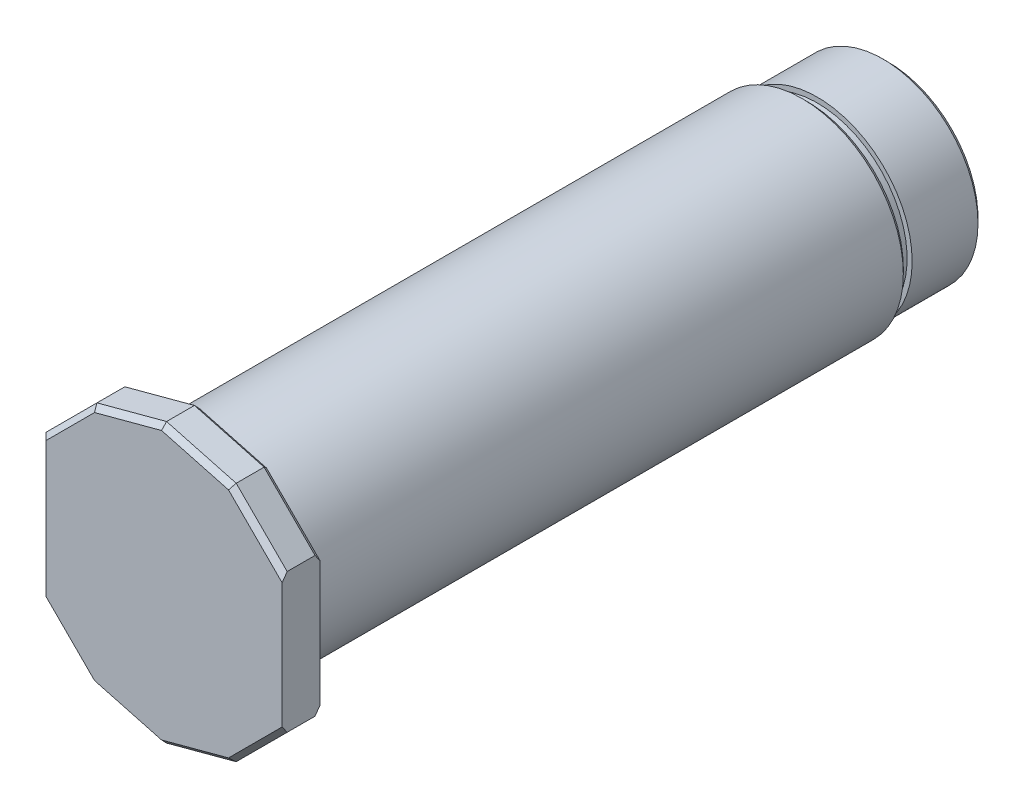
ISO-10303-21;
HEADER;
FILE_DESCRIPTION(('STEP AP214'),'2;1');
FILE_NAME('part.step','',(''),(''),'','','');
FILE_SCHEMA(('AUTOMOTIVE_DESIGN { 1 0 10303 214 1 1 1 1 }'));
ENDSEC;
DATA;
#1=APPLICATION_CONTEXT('core data for automotive mechanical design processes');
#2=APPLICATION_PROTOCOL_DEFINITION('international standard','automotive_design',2000,#1);
#3=PRODUCT_CONTEXT('',#1,'mechanical');
#4=PRODUCT('Part','Part','',(#3));
#5=PRODUCT_RELATED_PRODUCT_CATEGORY('part','',(#4));
#6=PRODUCT_DEFINITION_FORMATION('','',#4);
#7=PRODUCT_DEFINITION_CONTEXT('part definition',#1,'design');
#8=PRODUCT_DEFINITION('design','',#6,#7);
#9=PRODUCT_DEFINITION_SHAPE('','',#8);
#10=(LENGTH_UNIT() NAMED_UNIT(*) SI_UNIT(.MILLI.,.METRE.));
#11=(NAMED_UNIT(*) PLANE_ANGLE_UNIT() SI_UNIT($,.RADIAN.));
#12=(NAMED_UNIT(*) SI_UNIT($,.STERADIAN.) SOLID_ANGLE_UNIT());
#13=UNCERTAINTY_MEASURE_WITH_UNIT(LENGTH_MEASURE(1.E-05),#10,'distance_accuracy_value','');
#14=(GEOMETRIC_REPRESENTATION_CONTEXT(3) GLOBAL_UNCERTAINTY_ASSIGNED_CONTEXT((#13)) GLOBAL_UNIT_ASSIGNED_CONTEXT((#10,
#11,#12)) REPRESENTATION_CONTEXT('',''));
#15=CARTESIAN_POINT('',(0.,0.,0.));
#16=DIRECTION('',(0.,0.,1.));
#17=DIRECTION('',(1.,0.,0.));
#18=AXIS2_PLACEMENT_3D('',#15,#16,#17);
#19=CARTESIAN_POINT('',(0.,0.,-240.));
#20=DIRECTION('',(0.,0.,-1.));
#21=DIRECTION('',(-1.,0.,0.));
#22=AXIS2_PLACEMENT_3D('',#19,#20,#21);
#23=PLANE('',#22);
#24=CARTESIAN_POINT('',(0.,0.,-240.));
#25=DIRECTION('',(0.,0.,-1.));
#26=DIRECTION('',(-1.,0.,0.));
#27=AXIS2_PLACEMENT_3D('',#24,#25,#26);
#28=CIRCLE('',#27,38.0000000000001);
#29=CARTESIAN_POINT('',(-38.0000000000001,0.,-240.));
#30=VERTEX_POINT('',#29);
#31=EDGE_CURVE('E280',#30,#30,#28,.T.);
#32=ORIENTED_EDGE('',*,*,#31,.T.);
#33=EDGE_LOOP('',(#32));
#34=FACE_BOUND('',#33,.T.);
#35=CARTESIAN_POINT('',(0.,0.,-240.));
#36=DIRECTION('',(0.,0.,-1.));
#37=DIRECTION('',(-1.,0.,0.));
#38=AXIS2_PLACEMENT_3D('',#35,#36,#37);
#39=CIRCLE('',#38,35.5);
#40=CARTESIAN_POINT('',(-35.5,0.,-240.));
#41=VERTEX_POINT('',#40);
#42=EDGE_CURVE('E355',#41,#41,#39,.T.);
#43=ORIENTED_EDGE('',*,*,#42,.F.);
#44=EDGE_LOOP('',(#43));
#45=FACE_BOUND('',#44,.T.);
#46=ADVANCED_FACE('F36',(#34,#45),#23,.T.);
#47=CARTESIAN_POINT('',(0.,0.,0.));
#48=DIRECTION('',(0.,0.,1.));
#49=DIRECTION('',(1.,0.,0.));
#50=AXIS2_PLACEMENT_3D('',#47,#48,#49);
#51=PLANE('',#50);
#52=DIRECTION('',(0.,-1.,0.));
#53=VECTOR('',#52,1.);
#54=CARTESIAN_POINT('',(47.6313972081441,27.5,0.));
#55=LINE('',#54,#53);
#56=CARTESIAN_POINT('',(47.6313972081441,24.6715728752538,0.));
#57=VERTEX_POINT('',#56);
#58=CARTESIAN_POINT('',(47.6313972081441,-24.6715728752538,0.));
#59=VERTEX_POINT('',#58);
#60=EDGE_CURVE('E194',#57,#59,#55,.T.);
#61=ORIENTED_EDGE('',*,*,#60,.T.);
#62=DIRECTION('',(-0.707106781186548,-0.707106781186547,0.));
#63=VECTOR('',#62,1.);
#64=CARTESIAN_POINT('',(36.151485041699,-36.151485041699,0.));
#65=LINE('',#64,#63);
#66=CARTESIAN_POINT('',(26.46472381959,-45.838246263808,0.));
#67=VERTEX_POINT('',#66);
#68=EDGE_CURVE('E53',#59,#67,#65,.T.);
#69=ORIENTED_EDGE('',*,*,#68,.T.);
#70=DIRECTION('',(-0.965925826289068,-0.258819045102521,0.));
#71=VECTOR('',#70,1.);
#72=CARTESIAN_POINT('',(13.232361909795,-49.3838469514939,0.));
#73=LINE('',#72,#71);
#74=CARTESIAN_POINT('',(0.,-52.9294476391798,0.));
#75=VERTEX_POINT('',#74);
#76=EDGE_CURVE('E57',#67,#75,#73,.T.);
#77=ORIENTED_EDGE('',*,*,#76,.T.);
#78=DIRECTION('',(-0.965925826289068,0.25881904510252,0.));
#79=VECTOR('',#78,1.);
#80=CARTESIAN_POINT('',(-13.2323619097949,-49.3838469514939,0.));
#81=LINE('',#80,#79);
#82=CARTESIAN_POINT('',(-26.4647238195899,-45.838246263808,0.));
#83=VERTEX_POINT('',#82);
#84=EDGE_CURVE('E276',#75,#83,#81,.T.);
#85=ORIENTED_EDGE('',*,*,#84,.T.);
#86=DIRECTION('',(-0.707106781186547,0.707106781186548,0.));
#87=VECTOR('',#86,1.);
#88=CARTESIAN_POINT('',(-36.151485041699,-36.1514850416989,0.));
#89=LINE('',#88,#87);
#90=CARTESIAN_POINT('',(-45.6313972081441,-26.6715728752538,0.));
#91=VERTEX_POINT('',#90);
#92=EDGE_CURVE('E274',#83,#91,#89,.T.);
#93=ORIENTED_EDGE('',*,*,#92,.T.);
#94=DIRECTION('',(0.,1.,0.));
#95=VECTOR('',#94,1.);
#96=CARTESIAN_POINT('',(-45.6313972081441,0.,0.));
#97=LINE('',#96,#95);
#98=CARTESIAN_POINT('',(-45.6313972081441,26.6715728752538,0.));
#99=VERTEX_POINT('',#98);
#100=EDGE_CURVE('E272',#91,#99,#97,.T.);
#101=ORIENTED_EDGE('',*,*,#100,.T.);
#102=DIRECTION('',(0.707106781186547,0.707106781186548,0.));
#103=VECTOR('',#102,1.);
#104=CARTESIAN_POINT('',(-36.151485041699,36.151485041699,0.));
#105=LINE('',#104,#103);
#106=CARTESIAN_POINT('',(-26.4647238195899,45.838246263808,0.));
#107=VERTEX_POINT('',#106);
#108=EDGE_CURVE('E270',#99,#107,#105,.T.);
#109=ORIENTED_EDGE('',*,*,#108,.T.);
#110=DIRECTION('',(0.965925826289068,0.258819045102521,0.));
#111=VECTOR('',#110,1.);
#112=CARTESIAN_POINT('',(-13.2323619097949,49.3838469514939,0.));
#113=LINE('',#112,#111);
#114=CARTESIAN_POINT('',(0.,52.9294476391798,0.));
#115=VERTEX_POINT('',#114);
#116=EDGE_CURVE('E268',#107,#115,#113,.T.);
#117=ORIENTED_EDGE('',*,*,#116,.T.);
#118=DIRECTION('',(0.965925826289068,-0.25881904510252,0.));
#119=VECTOR('',#118,1.);
#120=CARTESIAN_POINT('',(13.2323619097949,49.383846951494,0.));
#121=LINE('',#120,#119);
#122=CARTESIAN_POINT('',(26.4647238195899,45.838246263808,0.));
#123=VERTEX_POINT('',#122);
#124=EDGE_CURVE('E266',#115,#123,#121,.T.);
#125=ORIENTED_EDGE('',*,*,#124,.T.);
#126=DIRECTION('',(0.707106781186548,-0.707106781186548,0.));
#127=VECTOR('',#126,1.);
#128=CARTESIAN_POINT('',(36.151485041699,36.151485041699,0.));
#129=LINE('',#128,#127);
#130=EDGE_CURVE('E264',#123,#57,#129,.T.);
#131=ORIENTED_EDGE('',*,*,#130,.T.);
#132=EDGE_LOOP('',(#61,#69,#77,#85,#93,#101,#109,#117,#125,#131));
#133=FACE_BOUND('',#132,.T.);
#134=CARTESIAN_POINT('',(0.,0.,0.));
#135=DIRECTION('',(0.,0.,1.));
#136=DIRECTION('',(1.,0.,0.));
#137=AXIS2_PLACEMENT_3D('',#134,#135,#136);
#138=CIRCLE('',#137,40.);
#139=CARTESIAN_POINT('',(40.,0.,0.));
#140=VERTEX_POINT('',#139);
#141=EDGE_CURVE('E202',#140,#140,#138,.F.);
#142=ORIENTED_EDGE('',*,*,#141,.F.);
#143=EDGE_LOOP('',(#142));
#144=FACE_BOUND('',#143,.T.);
#145=ADVANCED_FACE('F346',(#133,#144),#51,.F.);
#146=CARTESIAN_POINT('',(0.,55.,15.));
#147=DIRECTION('',(0.25881904510252,-0.965925826289068,0.));
#148=DIRECTION('',(0.965925826289069,0.258819045102521,0.));
#149=AXIS2_PLACEMENT_3D('',#146,#147,#148);
#150=PLANE('',#149);
#151=DIRECTION('',(0.,0.,-1.));
#152=VECTOR('',#151,1.);
#153=CARTESIAN_POINT('',(-27.5,47.6313972081441,15.));
#154=LINE('',#153,#152);
#155=CARTESIAN_POINT('',(-27.5,47.6313972081441,13.));
#156=VERTEX_POINT('',#155);
#157=CARTESIAN_POINT('',(-27.5,47.6313972081441,1.99999999999997));
#158=VERTEX_POINT('',#157);
#159=EDGE_CURVE('E207',#156,#158,#154,.T.);
#160=ORIENTED_EDGE('',*,*,#159,.F.);
#161=DIRECTION('',(0.965925826289069,0.258819045102521,0.));
#162=VECTOR('',#161,1.);
#163=CARTESIAN_POINT('',(0.,55.,13.));
#164=LINE('',#163,#162);
#165=CARTESIAN_POINT('',(0.,55.,13.));
#166=VERTEX_POINT('',#165);
#167=EDGE_CURVE('E254',#156,#166,#164,.T.);
#168=ORIENTED_EDGE('',*,*,#167,.T.);
#169=DIRECTION('',(0.,0.,-1.));
#170=VECTOR('',#169,1.);
#171=CARTESIAN_POINT('',(0.,55.,15.));
#172=LINE('',#171,#170);
#173=CARTESIAN_POINT('',(0.,55.,1.99999999999997));
#174=VERTEX_POINT('',#173);
#175=EDGE_CURVE('E349',#166,#174,#172,.T.);
#176=ORIENTED_EDGE('',*,*,#175,.T.);
#177=DIRECTION('',(-0.965925826289069,-0.258819045102521,0.));
#178=VECTOR('',#177,1.);
#179=CARTESIAN_POINT('',(0.,55.,1.99999999999997));
#180=LINE('',#179,#178);
#181=EDGE_CURVE('E252',#174,#158,#180,.T.);
#182=ORIENTED_EDGE('',*,*,#181,.T.);
#183=EDGE_LOOP('',(#160,#168,#176,#182));
#184=FACE_BOUND('',#183,.T.);
#185=ADVANCED_FACE('F431',(#184),#150,.F.);
#186=CARTESIAN_POINT('',(-27.5,47.6313972081441,15.));
#187=DIRECTION('',(0.707106781186548,-0.707106781186547,0.));
#188=DIRECTION('',(0.707106781186547,0.707106781186548,0.));
#189=AXIS2_PLACEMENT_3D('',#186,#187,#188);
#190=PLANE('',#189);
#191=DIRECTION('',(0.,0.,-1.));
#192=VECTOR('',#191,1.);
#193=CARTESIAN_POINT('',(-47.6313972081441,27.5,15.));
#194=LINE('',#193,#192);
#195=CARTESIAN_POINT('',(-47.6313972081441,27.5,13.));
#196=VERTEX_POINT('',#195);
#197=CARTESIAN_POINT('',(-47.6313972081441,27.5,1.99999999999997));
#198=VERTEX_POINT('',#197);
#199=EDGE_CURVE('E375',#196,#198,#194,.T.);
#200=ORIENTED_EDGE('',*,*,#199,.F.);
#201=DIRECTION('',(0.707106781186547,0.707106781186548,0.));
#202=VECTOR('',#201,1.);
#203=CARTESIAN_POINT('',(-27.5,47.6313972081441,13.));
#204=LINE('',#203,#202);
#205=EDGE_CURVE('E250',#196,#156,#204,.T.);
#206=ORIENTED_EDGE('',*,*,#205,.T.);
#207=ORIENTED_EDGE('',*,*,#159,.T.);
#208=DIRECTION('',(-0.707106781186547,-0.707106781186548,0.));
#209=VECTOR('',#208,1.);
#210=CARTESIAN_POINT('',(-27.5,47.6313972081441,1.99999999999997));
#211=LINE('',#210,#209);
#212=EDGE_CURVE('E248',#158,#198,#211,.T.);
#213=ORIENTED_EDGE('',*,*,#212,.T.);
#214=EDGE_LOOP('',(#200,#206,#207,#213));
#215=FACE_BOUND('',#214,.T.);
#216=ADVANCED_FACE('F382',(#215),#190,.F.);
#217=CARTESIAN_POINT('',(-47.6313972081441,-27.5,15.));
#218=DIRECTION('',(0.707106781186548,0.707106781186547,0.));
#219=DIRECTION('',(-0.707106781186547,0.707106781186548,0.));
#220=AXIS2_PLACEMENT_3D('',#217,#218,#219);
#221=PLANE('',#220);
#222=DIRECTION('',(0.,0.,-1.));
#223=VECTOR('',#222,1.);
#224=CARTESIAN_POINT('',(-27.5,-47.6313972081441,15.));
#225=LINE('',#224,#223);
#226=CARTESIAN_POINT('',(-27.5,-47.6313972081441,13.));
#227=VERTEX_POINT('',#226);
#228=CARTESIAN_POINT('',(-27.5,-47.6313972081441,1.99999999999997));
#229=VERTEX_POINT('',#228);
#230=EDGE_CURVE('E369',#227,#229,#225,.T.);
#231=ORIENTED_EDGE('',*,*,#230,.F.);
#232=DIRECTION('',(-0.707106781186547,0.707106781186548,0.));
#233=VECTOR('',#232,1.);
#234=CARTESIAN_POINT('',(-47.6313972081441,-27.5,13.));
#235=LINE('',#234,#233);
#236=CARTESIAN_POINT('',(-47.6313972081441,-27.5,13.));
#237=VERTEX_POINT('',#236);
#238=EDGE_CURVE('E242',#227,#237,#235,.T.);
#239=ORIENTED_EDGE('',*,*,#238,.T.);
#240=DIRECTION('',(0.,0.,-1.));
#241=VECTOR('',#240,1.);
#242=CARTESIAN_POINT('',(-47.6313972081441,-27.5,15.));
#243=LINE('',#242,#241);
#244=CARTESIAN_POINT('',(-47.6313972081441,-27.5,1.99999999999997));
#245=VERTEX_POINT('',#244);
#246=EDGE_CURVE('E372',#237,#245,#243,.T.);
#247=ORIENTED_EDGE('',*,*,#246,.T.);
#248=DIRECTION('',(0.707106781186547,-0.707106781186548,0.));
#249=VECTOR('',#248,1.);
#250=CARTESIAN_POINT('',(-47.6313972081441,-27.5,1.99999999999997));
#251=LINE('',#250,#249);
#252=EDGE_CURVE('E240',#245,#229,#251,.T.);
#253=ORIENTED_EDGE('',*,*,#252,.T.);
#254=EDGE_LOOP('',(#231,#239,#247,#253));
#255=FACE_BOUND('',#254,.T.);
#256=ADVANCED_FACE('F404',(#255),#221,.F.);
#257=CARTESIAN_POINT('',(-27.5,-47.6313972081441,15.));
#258=DIRECTION('',(0.25881904510252,0.965925826289068,0.));
#259=DIRECTION('',(-0.965925826289068,0.25881904510252,0.));
#260=AXIS2_PLACEMENT_3D('',#257,#258,#259);
#261=PLANE('',#260);
#262=DIRECTION('',(0.,0.,-1.));
#263=VECTOR('',#262,1.);
#264=CARTESIAN_POINT('',(0.,-55.,15.));
#265=LINE('',#264,#263);
#266=CARTESIAN_POINT('',(0.,-55.,13.));
#267=VERTEX_POINT('',#266);
#268=CARTESIAN_POINT('',(0.,-55.,1.99999999999997));
#269=VERTEX_POINT('',#268);
#270=EDGE_CURVE('E366',#267,#269,#265,.T.);
#271=ORIENTED_EDGE('',*,*,#270,.F.);
#272=DIRECTION('',(-0.965925826289068,0.25881904510252,0.));
#273=VECTOR('',#272,1.);
#274=CARTESIAN_POINT('',(-27.5,-47.6313972081441,13.));
#275=LINE('',#274,#273);
#276=EDGE_CURVE('E238',#267,#227,#275,.T.);
#277=ORIENTED_EDGE('',*,*,#276,.T.);
#278=ORIENTED_EDGE('',*,*,#230,.T.);
#279=DIRECTION('',(0.965925826289068,-0.25881904510252,0.));
#280=VECTOR('',#279,1.);
#281=CARTESIAN_POINT('',(-27.5,-47.6313972081441,1.99999999999997));
#282=LINE('',#281,#280);
#283=EDGE_CURVE('E236',#229,#269,#282,.T.);
#284=ORIENTED_EDGE('',*,*,#283,.T.);
#285=EDGE_LOOP('',(#271,#277,#278,#284));
#286=FACE_BOUND('',#285,.T.);
#287=ADVANCED_FACE('F482',(#286),#261,.F.);
#288=CARTESIAN_POINT('',(0.,-55.,15.));
#289=DIRECTION('',(-0.258819045102521,0.965925826289068,0.));
#290=DIRECTION('',(-0.965925826289068,-0.258819045102521,0.));
#291=AXIS2_PLACEMENT_3D('',#288,#289,#290);
#292=PLANE('',#291);
#293=DIRECTION('',(0.,0.,-1.));
#294=VECTOR('',#293,1.);
#295=CARTESIAN_POINT('',(27.5,-47.6313972081441,15.));
#296=LINE('',#295,#294);
#297=CARTESIAN_POINT('',(27.5,-47.6313972081441,13.));
#298=VERTEX_POINT('',#297);
#299=CARTESIAN_POINT('',(27.5,-47.6313972081441,1.99999999999997));
#300=VERTEX_POINT('',#299);
#301=EDGE_CURVE('E363',#298,#300,#296,.T.);
#302=ORIENTED_EDGE('',*,*,#301,.F.);
#303=DIRECTION('',(-0.965925826289068,-0.258819045102521,0.));
#304=VECTOR('',#303,1.);
#305=CARTESIAN_POINT('',(0.,-55.,13.));
#306=LINE('',#305,#304);
#307=EDGE_CURVE('E234',#298,#267,#306,.T.);
#308=ORIENTED_EDGE('',*,*,#307,.T.);
#309=ORIENTED_EDGE('',*,*,#270,.T.);
#310=DIRECTION('',(0.965925826289068,0.258819045102521,0.));
#311=VECTOR('',#310,1.);
#312=CARTESIAN_POINT('',(0.,-55.,1.99999999999997));
#313=LINE('',#312,#311);
#314=EDGE_CURVE('E232',#269,#300,#313,.T.);
#315=ORIENTED_EDGE('',*,*,#314,.T.);
#316=EDGE_LOOP('',(#302,#308,#309,#315));
#317=FACE_BOUND('',#316,.T.);
#318=ADVANCED_FACE('F478',(#317),#292,.F.);
#319=CARTESIAN_POINT('',(27.5,-47.6313972081441,15.));
#320=DIRECTION('',(-0.707106781186547,0.707106781186548,0.));
#321=DIRECTION('',(-0.707106781186548,-0.707106781186547,0.));
#322=AXIS2_PLACEMENT_3D('',#319,#320,#321);
#323=PLANE('',#322);
#324=DIRECTION('',(0.,0.,-1.));
#325=VECTOR('',#324,1.);
#326=CARTESIAN_POINT('',(47.6313972081441,-27.5,15.));
#327=LINE('',#326,#325);
#328=CARTESIAN_POINT('',(47.6313972081441,-27.5,13.));
#329=VERTEX_POINT('',#328);
#330=CARTESIAN_POINT('',(47.6313972081441,-27.5,1.99999999999997));
#331=VERTEX_POINT('',#330);
#332=EDGE_CURVE('E361',#329,#331,#327,.T.);
#333=ORIENTED_EDGE('',*,*,#332,.F.);
#334=DIRECTION('',(-0.707106781186548,-0.707106781186547,0.));
#335=VECTOR('',#334,1.);
#336=CARTESIAN_POINT('',(27.5,-47.6313972081441,13.));
#337=LINE('',#336,#335);
#338=EDGE_CURVE('E230',#329,#298,#337,.T.);
#339=ORIENTED_EDGE('',*,*,#338,.T.);
#340=ORIENTED_EDGE('',*,*,#301,.T.);
#341=DIRECTION('',(0.707106781186548,0.707106781186547,0.));
#342=VECTOR('',#341,1.);
#343=CARTESIAN_POINT('',(27.5,-47.6313972081441,1.99999999999997));
#344=LINE('',#343,#342);
#345=EDGE_CURVE('E227',#300,#331,#344,.T.);
#346=ORIENTED_EDGE('',*,*,#345,.T.);
#347=EDGE_LOOP('',(#333,#339,#340,#346));
#348=FACE_BOUND('',#347,.T.);
#349=ADVANCED_FACE('F474',(#348),#323,.F.);
#350=CARTESIAN_POINT('',(47.6313972081441,27.5,15.));
#351=DIRECTION('',(-0.707106781186547,-0.707106781186547,0.));
#352=DIRECTION('',(0.707106781186548,-0.707106781186548,0.));
#353=AXIS2_PLACEMENT_3D('',#350,#351,#352);
#354=PLANE('',#353);
#355=DIRECTION('',(0.,0.,-1.));
#356=VECTOR('',#355,1.);
#357=CARTESIAN_POINT('',(27.5,47.6313972081441,15.));
#358=LINE('',#357,#356);
#359=CARTESIAN_POINT('',(27.5,47.6313972081441,13.));
#360=VERTEX_POINT('',#359);
#361=CARTESIAN_POINT('',(27.5,47.6313972081441,1.99999999999997));
#362=VERTEX_POINT('',#361);
#363=EDGE_CURVE('E352',#360,#362,#358,.T.);
#364=ORIENTED_EDGE('',*,*,#363,.F.);
#365=DIRECTION('',(0.707106781186548,-0.707106781186548,0.));
#366=VECTOR('',#365,1.);
#367=CARTESIAN_POINT('',(47.6313972081441,27.5,13.));
#368=LINE('',#367,#366);
#369=CARTESIAN_POINT('',(47.6313972081441,27.5,13.));
#370=VERTEX_POINT('',#369);
#371=EDGE_CURVE('E262',#360,#370,#368,.T.);
#372=ORIENTED_EDGE('',*,*,#371,.T.);
#373=DIRECTION('',(0.,0.,-1.));
#374=VECTOR('',#373,1.);
#375=CARTESIAN_POINT('',(47.6313972081441,27.5,15.));
#376=LINE('',#375,#374);
#377=CARTESIAN_POINT('',(47.6313972081441,27.5,1.99999999999997));
#378=VERTEX_POINT('',#377);
#379=EDGE_CURVE('E180',#370,#378,#376,.T.);
#380=ORIENTED_EDGE('',*,*,#379,.T.);
#381=DIRECTION('',(-0.707106781186548,0.707106781186548,0.));
#382=VECTOR('',#381,1.);
#383=CARTESIAN_POINT('',(47.6313972081441,27.5,1.99999999999997));
#384=LINE('',#383,#382);
#385=EDGE_CURVE('E260',#378,#362,#384,.T.);
#386=ORIENTED_EDGE('',*,*,#385,.T.);
#387=EDGE_LOOP('',(#364,#372,#380,#386));
#388=FACE_BOUND('',#387,.T.);
#389=ADVANCED_FACE('F471',(#388),#354,.F.);
#390=CARTESIAN_POINT('',(27.5,47.6313972081441,15.));
#391=DIRECTION('',(-0.25881904510252,-0.965925826289068,0.));
#392=DIRECTION('',(0.965925826289068,-0.25881904510252,0.));
#393=AXIS2_PLACEMENT_3D('',#390,#391,#392);
#394=PLANE('',#393);
#395=ORIENTED_EDGE('',*,*,#175,.F.);
#396=DIRECTION('',(0.965925826289068,-0.25881904510252,0.));
#397=VECTOR('',#396,1.);
#398=CARTESIAN_POINT('',(27.5,47.6313972081441,13.));
#399=LINE('',#398,#397);
#400=EDGE_CURVE('E258',#166,#360,#399,.T.);
#401=ORIENTED_EDGE('',*,*,#400,.T.);
#402=ORIENTED_EDGE('',*,*,#363,.T.);
#403=DIRECTION('',(-0.965925826289068,0.25881904510252,0.));
#404=VECTOR('',#403,1.);
#405=CARTESIAN_POINT('',(27.5,47.6313972081441,1.99999999999997));
#406=LINE('',#405,#404);
#407=EDGE_CURVE('E256',#362,#174,#406,.T.);
#408=ORIENTED_EDGE('',*,*,#407,.T.);
#409=EDGE_LOOP('',(#395,#401,#402,#408));
#410=FACE_BOUND('',#409,.T.);
#411=ADVANCED_FACE('F434',(#410),#394,.F.);
#412=CARTESIAN_POINT('',(0.,0.,15.));
#413=DIRECTION('',(0.,0.,1.));
#414=DIRECTION('',(1.,0.,0.));
#415=AXIS2_PLACEMENT_3D('',#412,#413,#414);
#416=PLANE('',#415);
#417=DIRECTION('',(0.965925826289068,0.258819045102521,0.));
#418=VECTOR('',#417,1.);
#419=CARTESIAN_POINT('',(26.982361909795,-45.699545555566,15.));
#420=LINE('',#419,#418);
#421=CARTESIAN_POINT('',(0.,-52.9294476391798,15.));
#422=VERTEX_POINT('',#421);
#423=CARTESIAN_POINT('',(26.46472381959,-45.838246263808,15.));
#424=VERTEX_POINT('',#423);
#425=EDGE_CURVE('E220',#422,#424,#420,.T.);
#426=ORIENTED_EDGE('',*,*,#425,.T.);
#427=DIRECTION('',(0.707106781186548,0.707106781186547,0.));
#428=VECTOR('',#427,1.);
#429=CARTESIAN_POINT('',(46.2171836457711,-26.0857864376269,15.));
#430=LINE('',#429,#428);
#431=CARTESIAN_POINT('',(47.6313972081441,-24.6715728752539,15.));
#432=VERTEX_POINT('',#431);
#433=EDGE_CURVE('E193',#424,#432,#430,.T.);
#434=ORIENTED_EDGE('',*,*,#433,.T.);
#435=DIRECTION('',(0.,-1.,0.));
#436=VECTOR('',#435,1.);
#437=CARTESIAN_POINT('',(47.6313972081441,27.5,15.));
#438=LINE('',#437,#436);
#439=CARTESIAN_POINT('',(47.6313972081441,24.6715728752539,15.));
#440=VERTEX_POINT('',#439);
#441=EDGE_CURVE('E178',#440,#432,#438,.T.);
#442=ORIENTED_EDGE('',*,*,#441,.F.);
#443=DIRECTION('',(-0.707106781186548,0.707106781186548,0.));
#444=VECTOR('',#443,1.);
#445=CARTESIAN_POINT('',(26.0857864376269,46.2171836457711,15.));
#446=LINE('',#445,#444);
#447=CARTESIAN_POINT('',(26.46472381959,45.8382462638081,15.));
#448=VERTEX_POINT('',#447);
#449=EDGE_CURVE('E190',#440,#448,#446,.T.);
#450=ORIENTED_EDGE('',*,*,#449,.T.);
#451=DIRECTION('',(-0.965925826289068,0.25881904510252,0.));
#452=VECTOR('',#451,1.);
#453=CARTESIAN_POINT('',(-0.517638090205031,53.0681483474219,15.));
#454=LINE('',#453,#452);
#455=CARTESIAN_POINT('',(0.,52.9294476391799,15.));
#456=VERTEX_POINT('',#455);
#457=EDGE_CURVE('E201',#448,#456,#454,.T.);
#458=ORIENTED_EDGE('',*,*,#457,.T.);
#459=DIRECTION('',(-0.965925826289068,-0.258819045102521,0.));
#460=VECTOR('',#459,1.);
#461=CARTESIAN_POINT('',(-26.982361909795,45.699545555566,15.));
#462=LINE('',#461,#460);
#463=CARTESIAN_POINT('',(-26.46472381959,45.8382462638081,15.));
#464=VERTEX_POINT('',#463);
#465=EDGE_CURVE('E204',#456,#464,#462,.T.);
#466=ORIENTED_EDGE('',*,*,#465,.T.);
#467=DIRECTION('',(-0.707106781186547,-0.707106781186548,0.));
#468=VECTOR('',#467,1.);
#469=CARTESIAN_POINT('',(-46.2171836457711,26.085786437627,15.));
#470=LINE('',#469,#468);
#471=CARTESIAN_POINT('',(-45.6313972081442,26.6715728752538,15.));
#472=VERTEX_POINT('',#471);
#473=EDGE_CURVE('E212',#464,#472,#470,.T.);
#474=ORIENTED_EDGE('',*,*,#473,.T.);
#475=DIRECTION('',(0.,-1.,0.));
#476=VECTOR('',#475,1.);
#477=CARTESIAN_POINT('',(-45.6313972081442,-27.5,15.));
#478=LINE('',#477,#476);
#479=CARTESIAN_POINT('',(-45.6313972081442,-26.6715728752538,15.));
#480=VERTEX_POINT('',#479);
#481=EDGE_CURVE('E214',#472,#480,#478,.T.);
#482=ORIENTED_EDGE('',*,*,#481,.T.);
#483=DIRECTION('',(0.707106781186547,-0.707106781186548,0.));
#484=VECTOR('',#483,1.);
#485=CARTESIAN_POINT('',(-26.0857864376269,-46.217183645771,15.));
#486=LINE('',#485,#484);
#487=CARTESIAN_POINT('',(-26.4647238195899,-45.838246263808,15.));
#488=VERTEX_POINT('',#487);
#489=EDGE_CURVE('E216',#480,#488,#486,.T.);
#490=ORIENTED_EDGE('',*,*,#489,.T.);
#491=DIRECTION('',(0.965925826289068,-0.25881904510252,0.));
#492=VECTOR('',#491,1.);
#493=CARTESIAN_POINT('',(0.517638090205093,-53.0681483474219,15.));
#494=LINE('',#493,#492);
#495=EDGE_CURVE('E218',#488,#422,#494,.T.);
#496=ORIENTED_EDGE('',*,*,#495,.T.);
#497=EDGE_LOOP('',(#426,#434,#442,#450,#458,#466,#474,#482,#490,#496));
#498=FACE_BOUND('',#497,.T.);
#499=ADVANCED_FACE('F189',(#498),#416,.T.);
#500=CARTESIAN_POINT('',(-47.6313972081441,27.5,0.));
#501=DIRECTION('',(1.,0.,0.));
#502=DIRECTION('',(0.,1.,0.));
#503=AXIS2_PLACEMENT_3D('',#500,#501,#502);
#504=PLANE('',#503);
#505=ORIENTED_EDGE('',*,*,#246,.F.);
#506=DIRECTION('',(0.,1.,0.));
#507=VECTOR('',#506,1.);
#508=CARTESIAN_POINT('',(-47.6313972081441,27.5,13.));
#509=LINE('',#508,#507);
#510=EDGE_CURVE('E246',#237,#196,#509,.T.);
#511=ORIENTED_EDGE('',*,*,#510,.T.);
#512=ORIENTED_EDGE('',*,*,#199,.T.);
#513=DIRECTION('',(0.,-1.,0.));
#514=VECTOR('',#513,1.);
#515=CARTESIAN_POINT('',(-47.6313972081441,27.5,1.99999999999997));
#516=LINE('',#515,#514);
#517=EDGE_CURVE('E244',#198,#245,#516,.T.);
#518=ORIENTED_EDGE('',*,*,#517,.T.);
#519=EDGE_LOOP('',(#505,#511,#512,#518));
#520=FACE_BOUND('',#519,.T.);
#521=ADVANCED_FACE('F400',(#520),#504,.F.);
#522=CARTESIAN_POINT('',(47.6313972081441,27.5,0.));
#523=DIRECTION('',(-1.,0.,0.));
#524=DIRECTION('',(0.,-1.,0.));
#525=AXIS2_PLACEMENT_3D('',#522,#523,#524);
#526=PLANE('',#525);
#527=ORIENTED_EDGE('',*,*,#441,.T.);
#528=DIRECTION('',(0.,-0.816496580927723,-0.57735026918963));
#529=VECTOR('',#528,1.);
#530=CARTESIAN_POINT('',(47.6313972081441,-32.3248476528839,9.58831750645377));
#531=LINE('',#530,#529);
#532=EDGE_CURVE('E184',#432,#329,#531,.T.);
#533=ORIENTED_EDGE('',*,*,#532,.T.);
#534=ORIENTED_EDGE('',*,*,#332,.T.);
#535=DIRECTION('',(0.,-0.816496580927728,0.577350269189623));
#536=VECTOR('',#535,1.);
#537=CARTESIAN_POINT('',(47.6313972081441,-40.9209314720961,11.490031653759));
#538=LINE('',#537,#536);
#539=EDGE_CURVE('E185',#331,#59,#538,.F.);
#540=ORIENTED_EDGE('',*,*,#539,.T.);
#541=ORIENTED_EDGE('',*,*,#60,.F.);
#542=DIRECTION('',(0.,-0.816496580927727,-0.577350269189624));
#543=VECTOR('',#542,1.);
#544=CARTESIAN_POINT('',(47.6313972081441,27.5,1.99999999999997));
#545=LINE('',#544,#543);
#546=EDGE_CURVE('E223',#57,#378,#545,.F.);
#547=ORIENTED_EDGE('',*,*,#546,.T.);
#548=ORIENTED_EDGE('',*,*,#379,.F.);
#549=DIRECTION('',(0.,-0.816496580927722,0.577350269189631));
#550=VECTOR('',#549,1.);
#551=CARTESIAN_POINT('',(47.6313972081441,32.3248476528839,9.58831750645378));
#552=LINE('',#551,#550);
#553=EDGE_CURVE('E175',#370,#440,#552,.T.);
#554=ORIENTED_EDGE('',*,*,#553,.T.);
#555=EDGE_LOOP('',(#527,#533,#534,#540,#541,#547,#548,#554));
#556=FACE_BOUND('',#555,.T.);
#557=ADVANCED_FACE('F177',(#556),#526,.F.);
#558=CARTESIAN_POINT('',(0.,0.,-240.));
#559=DIRECTION('',(0.,0.,1.));
#560=DIRECTION('',(1.,0.,0.));
#561=AXIS2_PLACEMENT_3D('',#558,#559,#560);
#562=CYLINDRICAL_SURFACE('',#561,40.);
#563=CARTESIAN_POINT('',(0.,0.,-238.));
#564=DIRECTION('',(0.,0.,-1.));
#565=DIRECTION('',(-1.,0.,0.));
#566=AXIS2_PLACEMENT_3D('',#563,#564,#565);
#567=CIRCLE('',#566,40.);
#568=CARTESIAN_POINT('',(-40.,0.,-238.));
#569=VERTEX_POINT('',#568);
#570=EDGE_CURVE('E283',#569,#569,#567,.F.);
#571=ORIENTED_EDGE('',*,*,#570,.T.);
#572=EDGE_LOOP('',(#571));
#573=FACE_BOUND('',#572,.T.);
#574=ORIENTED_EDGE('',*,*,#141,.T.);
#575=EDGE_LOOP('',(#574));
#576=FACE_BOUND('',#575,.T.);
#577=ADVANCED_FACE('F459',(#573,#576),#562,.T.);
#578=CARTESIAN_POINT('',(0.,0.,-244.));
#579=DIRECTION('',(0.,0.,1.));
#580=DIRECTION('',(1.,0.,0.));
#581=AXIS2_PLACEMENT_3D('',#578,#579,#580);
#582=CYLINDRICAL_SURFACE('',#581,35.5);
#583=CARTESIAN_POINT('',(0.,0.,-244.));
#584=DIRECTION('',(0.,0.,-1.));
#585=DIRECTION('',(-1.,0.,0.));
#586=AXIS2_PLACEMENT_3D('',#583,#584,#585);
#587=CIRCLE('',#586,35.5);
#588=CARTESIAN_POINT('',(-35.5,0.,-244.));
#589=VERTEX_POINT('',#588);
#590=EDGE_CURVE('E195',#589,#589,#587,.T.);
#591=ORIENTED_EDGE('',*,*,#590,.F.);
#592=EDGE_LOOP('',(#591));
#593=FACE_BOUND('',#592,.T.);
#594=ORIENTED_EDGE('',*,*,#42,.T.);
#595=EDGE_LOOP('',(#594));
#596=FACE_BOUND('',#595,.T.);
#597=ADVANCED_FACE('F457',(#593,#596),#582,.T.);
#598=CARTESIAN_POINT('',(0.,0.,-244.));
#599=DIRECTION('',(0.,0.,-1.));
#600=DIRECTION('',(-1.,0.,0.));
#601=AXIS2_PLACEMENT_3D('',#598,#599,#600);
#602=PLANE('',#601);
#603=CARTESIAN_POINT('',(0.,0.,-244.));
#604=DIRECTION('',(0.,0.,-1.));
#605=DIRECTION('',(-1.,0.,0.));
#606=AXIS2_PLACEMENT_3D('',#603,#604,#605);
#607=CIRCLE('',#606,37.5);
#608=CARTESIAN_POINT('',(-37.5,0.,-244.));
#609=VERTEX_POINT('',#608);
#610=EDGE_CURVE('E310',#609,#609,#607,.T.);
#611=ORIENTED_EDGE('',*,*,#610,.F.);
#612=EDGE_LOOP('',(#611));
#613=FACE_BOUND('',#612,.T.);
#614=ORIENTED_EDGE('',*,*,#590,.T.);
#615=EDGE_LOOP('',(#614));
#616=FACE_BOUND('',#615,.T.);
#617=ADVANCED_FACE('F671',(#613,#616),#602,.F.);
#618=CARTESIAN_POINT('',(0.,0.,-272.));
#619=DIRECTION('',(0.,0.,1.));
#620=DIRECTION('',(1.,0.,0.));
#621=AXIS2_PLACEMENT_3D('',#618,#619,#620);
#622=CYLINDRICAL_SURFACE('',#621,37.5);
#623=CARTESIAN_POINT('',(0.,0.,-270.));
#624=DIRECTION('',(0.,0.,-1.));
#625=DIRECTION('',(-1.,0.,0.));
#626=AXIS2_PLACEMENT_3D('',#623,#624,#625);
#627=CIRCLE('',#626,37.5);
#628=CARTESIAN_POINT('',(-37.5,0.,-270.));
#629=VERTEX_POINT('',#628);
#630=EDGE_CURVE('E11',#629,#629,#627,.F.);
#631=ORIENTED_EDGE('',*,*,#630,.T.);
#632=EDGE_LOOP('',(#631));
#633=FACE_BOUND('',#632,.T.);
#634=ORIENTED_EDGE('',*,*,#610,.T.);
#635=EDGE_LOOP('',(#634));
#636=FACE_BOUND('',#635,.T.);
#637=ADVANCED_FACE('F662',(#633,#636),#622,.T.);
#638=CARTESIAN_POINT('',(0.,0.,-272.));
#639=DIRECTION('',(0.,0.,-1.));
#640=DIRECTION('',(-1.,0.,0.));
#641=AXIS2_PLACEMENT_3D('',#638,#639,#640);
#642=PLANE('',#641);
#643=CARTESIAN_POINT('',(0.,0.,-272.));
#644=DIRECTION('',(0.,0.,-1.));
#645=DIRECTION('',(-1.,0.,0.));
#646=AXIS2_PLACEMENT_3D('',#643,#644,#645);
#647=CIRCLE('',#646,35.5);
#648=CARTESIAN_POINT('',(-35.5,0.,-272.));
#649=VERTEX_POINT('',#648);
#650=EDGE_CURVE('E45',#649,#649,#647,.T.);
#651=ORIENTED_EDGE('',*,*,#650,.T.);
#652=EDGE_LOOP('',(#651));
#653=FACE_BOUND('',#652,.T.);
#654=ADVANCED_FACE('F445',(#653),#642,.T.);
#655=CARTESIAN_POINT('',(36.151485041699,36.151485041699,15.));
#656=DIRECTION('',(0.500000000000004,0.500000000000004,0.707106781186543));
#657=DIRECTION('',(0.707106781186548,-0.707106781186548,0.));
#658=AXIS2_PLACEMENT_3D('',#655,#656,#657);
#659=PLANE('',#658);
#660=ORIENTED_EDGE('',*,*,#553,.F.);
#661=ORIENTED_EDGE('',*,*,#371,.F.);
#662=DIRECTION('',(-0.35962729833819,-0.622892752510499,0.694746590606869));
#663=VECTOR('',#662,1.);
#664=CARTESIAN_POINT('',(25.5476060261541,44.2497516490515,16.7717355248581));
#665=LINE('',#664,#663);
#666=EDGE_CURVE('E199',#448,#360,#665,.F.);
#667=ORIENTED_EDGE('',*,*,#666,.F.);
#668=ORIENTED_EDGE('',*,*,#449,.F.);
#669=EDGE_LOOP('',(#660,#661,#667,#668));
#670=FACE_BOUND('',#669,.T.);
#671=ADVANCED_FACE('F197',(#670),#659,.T.);
#672=CARTESIAN_POINT('',(13.2323619097949,49.383846951494,15.));
#673=DIRECTION('',(0.183012701892219,0.683012701892221,0.707106781186546));
#674=DIRECTION('',(0.965925826289068,-0.25881904510252,0.));
#675=AXIS2_PLACEMENT_3D('',#672,#673,#674);
#676=PLANE('',#675);
#677=ORIENTED_EDGE('',*,*,#666,.T.);
#678=ORIENTED_EDGE('',*,*,#400,.F.);
#679=DIRECTION('',(0.,-0.719254596676402,0.694746590606868));
#680=VECTOR('',#679,1.);
#681=CARTESIAN_POINT('',(0.,51.0952120523081,16.771735524858));
#682=LINE('',#681,#680);
#683=EDGE_CURVE('E306',#456,#166,#682,.F.);
#684=ORIENTED_EDGE('',*,*,#683,.F.);
#685=ORIENTED_EDGE('',*,*,#457,.F.);
#686=EDGE_LOOP('',(#677,#678,#684,#685));
#687=FACE_BOUND('',#686,.T.);
#688=ADVANCED_FACE('F437',(#687),#676,.T.);
#689=CARTESIAN_POINT('',(-13.232361909795,49.383846951494,15.));
#690=DIRECTION('',(-0.18301270189222,0.683012701892221,0.707106781186546));
#691=DIRECTION('',(0.965925826289069,0.258819045102521,0.));
#692=AXIS2_PLACEMENT_3D('',#689,#690,#691);
#693=PLANE('',#692);
#694=ORIENTED_EDGE('',*,*,#683,.T.);
#695=ORIENTED_EDGE('',*,*,#167,.F.);
#696=DIRECTION('',(0.359627298338196,-0.622892752510497,0.694746590606868));
#697=VECTOR('',#696,1.);
#698=CARTESIAN_POINT('',(-25.5476060261541,44.2497516490517,16.7717355248579));
#699=LINE('',#698,#697);
#700=EDGE_CURVE('E303',#464,#156,#699,.F.);
#701=ORIENTED_EDGE('',*,*,#700,.F.);
#702=ORIENTED_EDGE('',*,*,#465,.F.);
#703=EDGE_LOOP('',(#694,#695,#701,#702));
#704=FACE_BOUND('',#703,.T.);
#705=ADVANCED_FACE('F428',(#704),#693,.T.);
#706=CARTESIAN_POINT('',(-36.151485041699,36.151485041699,15.));
#707=DIRECTION('',(-0.500000000000002,0.500000000000002,0.707106781186544));
#708=DIRECTION('',(0.707106781186547,0.707106781186548,0.));
#709=AXIS2_PLACEMENT_3D('',#706,#707,#708);
#710=PLANE('',#709);
#711=ORIENTED_EDGE('',*,*,#700,.T.);
#712=ORIENTED_EDGE('',*,*,#205,.F.);
#713=DIRECTION('',(0.678598344545844,-0.281084637714819,0.67859834454585));
#714=VECTOR('',#713,1.);
#715=CARTESIAN_POINT('',(-43.0741705820984,25.6123349246841,17.5572266260458));
#716=LINE('',#715,#714);
#717=EDGE_CURVE('E300',#472,#196,#716,.F.);
#718=ORIENTED_EDGE('',*,*,#717,.F.);
#719=ORIENTED_EDGE('',*,*,#473,.F.);
#720=EDGE_LOOP('',(#711,#712,#718,#719));
#721=FACE_BOUND('',#720,.T.);
#722=ADVANCED_FACE('F424',(#721),#710,.T.);
#723=CARTESIAN_POINT('',(-47.6313972081441,27.5,13.));
#724=DIRECTION('',(-0.707106781186551,0.,0.707106781186544));
#725=DIRECTION('',(0.,-1.,0.));
#726=AXIS2_PLACEMENT_3D('',#723,#724,#725);
#727=PLANE('',#726);
#728=ORIENTED_EDGE('',*,*,#717,.T.);
#729=ORIENTED_EDGE('',*,*,#510,.F.);
#730=DIRECTION('',(0.678598344545844,0.28108463771482,0.67859834454585));
#731=VECTOR('',#730,1.);
#732=CARTESIAN_POINT('',(-37.1405008674641,-23.15452845424,23.4908963406801));
#733=LINE('',#732,#731);
#734=EDGE_CURVE('E297',#480,#237,#733,.F.);
#735=ORIENTED_EDGE('',*,*,#734,.F.);
#736=ORIENTED_EDGE('',*,*,#481,.F.);
#737=EDGE_LOOP('',(#728,#729,#735,#736));
#738=FACE_BOUND('',#737,.T.);
#739=ADVANCED_FACE('F422',(#738),#727,.T.);
#740=CARTESIAN_POINT('',(-36.151485041699,-36.151485041699,15.));
#741=DIRECTION('',(-0.500000000000002,-0.500000000000002,0.707106781186545));
#742=DIRECTION('',(-0.707106781186547,0.707106781186548,0.));
#743=AXIS2_PLACEMENT_3D('',#740,#741,#742);
#744=PLANE('',#743);
#745=ORIENTED_EDGE('',*,*,#734,.T.);
#746=ORIENTED_EDGE('',*,*,#238,.F.);
#747=DIRECTION('',(0.359627298338202,0.622892752510493,0.694746590606869));
#748=VECTOR('',#747,1.);
#749=CARTESIAN_POINT('',(-25.547606026154,-44.2497516490516,16.7717355248579));
#750=LINE('',#749,#748);
#751=EDGE_CURVE('E294',#488,#227,#750,.F.);
#752=ORIENTED_EDGE('',*,*,#751,.F.);
#753=ORIENTED_EDGE('',*,*,#489,.F.);
#754=EDGE_LOOP('',(#745,#746,#752,#753));
#755=FACE_BOUND('',#754,.T.);
#756=ADVANCED_FACE('F408',(#755),#744,.T.);
#757=CARTESIAN_POINT('',(-13.2323619097949,-49.3838469514939,15.));
#758=DIRECTION('',(-0.18301270189222,-0.683012701892223,0.707106781186544));
#759=DIRECTION('',(-0.965925826289068,0.25881904510252,0.));
#760=AXIS2_PLACEMENT_3D('',#757,#758,#759);
#761=PLANE('',#760);
#762=ORIENTED_EDGE('',*,*,#751,.T.);
#763=ORIENTED_EDGE('',*,*,#276,.F.);
#764=DIRECTION('',(0.,0.719254596676401,0.694746590606868));
#765=VECTOR('',#764,1.);
#766=CARTESIAN_POINT('',(0.,-51.095212052308,16.771735524858));
#767=LINE('',#766,#765);
#768=EDGE_CURVE('E291',#422,#267,#767,.F.);
#769=ORIENTED_EDGE('',*,*,#768,.F.);
#770=ORIENTED_EDGE('',*,*,#495,.F.);
#771=EDGE_LOOP('',(#762,#763,#769,#770));
#772=FACE_BOUND('',#771,.T.);
#773=ADVANCED_FACE('F414',(#772),#761,.T.);
#774=CARTESIAN_POINT('',(13.232361909795,-49.383846951494,15.));
#775=DIRECTION('',(0.18301270189222,-0.683012701892221,0.707106781186546));
#776=DIRECTION('',(-0.965925826289068,-0.258819045102521,0.));
#777=AXIS2_PLACEMENT_3D('',#774,#775,#776);
#778=PLANE('',#777);
#779=ORIENTED_EDGE('',*,*,#768,.T.);
#780=ORIENTED_EDGE('',*,*,#307,.F.);
#781=DIRECTION('',(-0.359627298338194,0.622892752510497,0.694746590606869));
#782=VECTOR('',#781,1.);
#783=CARTESIAN_POINT('',(25.5476060261541,-44.2497516490517,16.7717355248579));
#784=LINE('',#783,#782);
#785=EDGE_CURVE('E288',#424,#298,#784,.F.);
#786=ORIENTED_EDGE('',*,*,#785,.F.);
#787=ORIENTED_EDGE('',*,*,#425,.F.);
#788=EDGE_LOOP('',(#779,#780,#786,#787));
#789=FACE_BOUND('',#788,.T.);
#790=ADVANCED_FACE('F496',(#789),#778,.T.);
#791=CARTESIAN_POINT('',(36.151485041699,-36.151485041699,15.));
#792=DIRECTION('',(0.500000000000003,-0.500000000000003,0.707106781186544));
#793=DIRECTION('',(-0.707106781186548,-0.707106781186547,0.));
#794=AXIS2_PLACEMENT_3D('',#791,#792,#793);
#795=PLANE('',#794);
#796=ORIENTED_EDGE('',*,*,#785,.T.);
#797=ORIENTED_EDGE('',*,*,#338,.F.);
#798=ORIENTED_EDGE('',*,*,#532,.F.);
#799=ORIENTED_EDGE('',*,*,#433,.F.);
#800=EDGE_LOOP('',(#796,#797,#798,#799));
#801=FACE_BOUND('',#800,.T.);
#802=ADVANCED_FACE('F493',(#801),#795,.T.);
#803=CARTESIAN_POINT('',(47.6313972081441,27.5,1.99999999999997));
#804=DIRECTION('',(-0.499999999999999,-0.499999999999999,0.707106781186549));
#805=DIRECTION('',(-0.707106781186548,0.707106781186548,0.));
#806=AXIS2_PLACEMENT_3D('',#803,#804,#805);
#807=PLANE('',#806);
#808=ORIENTED_EDGE('',*,*,#546,.F.);
#809=ORIENTED_EDGE('',*,*,#130,.F.);
#810=DIRECTION('',(0.359627298338199,0.622892752510501,0.694746590606863));
#811=VECTOR('',#810,1.);
#812=CARTESIAN_POINT('',(25.594010767585,44.3301270189221,-1.68208844843711));
#813=LINE('',#812,#811);
#814=EDGE_CURVE('E40',#362,#123,#813,.F.);
#815=ORIENTED_EDGE('',*,*,#814,.F.);
#816=ORIENTED_EDGE('',*,*,#385,.F.);
#817=EDGE_LOOP('',(#808,#809,#815,#816));
#818=FACE_BOUND('',#817,.T.);
#819=ADVANCED_FACE('F344',(#818),#807,.F.);
#820=CARTESIAN_POINT('',(27.5,47.6313972081441,1.99999999999997));
#821=DIRECTION('',(-0.183012701892218,-0.683012701892216,0.707106781186551));
#822=DIRECTION('',(-0.965925826289068,0.25881904510252,0.));
#823=AXIS2_PLACEMENT_3D('',#820,#821,#822);
#824=PLANE('',#823);
#825=ORIENTED_EDGE('',*,*,#814,.T.);
#826=ORIENTED_EDGE('',*,*,#124,.F.);
#827=DIRECTION('',(0.,0.719254596676407,0.694746590606862));
#828=VECTOR('',#827,1.);
#829=CARTESIAN_POINT('',(0.,51.1880215351699,-1.68208844843711));
#830=LINE('',#829,#828);
#831=EDGE_CURVE('E328',#174,#115,#830,.F.);
#832=ORIENTED_EDGE('',*,*,#831,.F.);
#833=ORIENTED_EDGE('',*,*,#407,.F.);
#834=EDGE_LOOP('',(#825,#826,#832,#833));
#835=FACE_BOUND('',#834,.T.);
#836=ADVANCED_FACE('F339',(#835),#824,.F.);
#837=CARTESIAN_POINT('',(0.,55.,1.99999999999997));
#838=DIRECTION('',(0.183012701892218,-0.683012701892215,0.707106781186552));
#839=DIRECTION('',(-0.965925826289069,-0.258819045102521,0.));
#840=AXIS2_PLACEMENT_3D('',#837,#838,#839);
#841=PLANE('',#840);
#842=ORIENTED_EDGE('',*,*,#831,.T.);
#843=ORIENTED_EDGE('',*,*,#116,.F.);
#844=DIRECTION('',(-0.359627298338201,0.622892752510501,0.694746590606862));
#845=VECTOR('',#844,1.);
#846=CARTESIAN_POINT('',(-25.594010767585,44.3301270189222,-1.68208844843696));
#847=LINE('',#846,#845);
#848=EDGE_CURVE('E326',#158,#107,#847,.F.);
#849=ORIENTED_EDGE('',*,*,#848,.F.);
#850=ORIENTED_EDGE('',*,*,#181,.F.);
#851=EDGE_LOOP('',(#842,#843,#849,#850));
#852=FACE_BOUND('',#851,.T.);
#853=ADVANCED_FACE('F387',(#852),#841,.F.);
#854=CARTESIAN_POINT('',(-27.5,47.6313972081441,1.99999999999997));
#855=DIRECTION('',(0.499999999999998,-0.499999999999997,0.707106781186551));
#856=DIRECTION('',(-0.707106781186547,-0.707106781186548,0.));
#857=AXIS2_PLACEMENT_3D('',#854,#855,#856);
#858=PLANE('',#857);
#859=ORIENTED_EDGE('',*,*,#848,.T.);
#860=ORIENTED_EDGE('',*,*,#108,.F.);
#861=DIRECTION('',(-0.678598344545851,0.28108463771482,0.678598344545843));
#862=VECTOR('',#861,1.);
#863=CARTESIAN_POINT('',(-42.2009096618154,25.2506184080125,-3.43048754632872));
#864=LINE('',#863,#862);
#865=EDGE_CURVE('E323',#198,#99,#864,.F.);
#866=ORIENTED_EDGE('',*,*,#865,.F.);
#867=ORIENTED_EDGE('',*,*,#212,.F.);
#868=EDGE_LOOP('',(#859,#860,#866,#867));
#869=FACE_BOUND('',#868,.T.);
#870=ADVANCED_FACE('F391',(#869),#858,.F.);
#871=CARTESIAN_POINT('',(-45.6313972081441,0.,0.));
#872=DIRECTION('',(0.707106781186543,0.,0.707106781186552));
#873=DIRECTION('',(0.,1.,0.));
#874=AXIS2_PLACEMENT_3D('',#871,#872,#873);
#875=PLANE('',#874);
#876=ORIENTED_EDGE('',*,*,#865,.T.);
#877=ORIENTED_EDGE('',*,*,#100,.F.);
#878=DIRECTION('',(-0.678598344545851,-0.281084637714819,0.678598344545843));
#879=VECTOR('',#878,1.);
#880=CARTESIAN_POINT('',(-40.5439661849226,-24.5642899477979,-5.08743102322142));
#881=LINE('',#880,#879);
#882=EDGE_CURVE('E320',#245,#91,#881,.F.);
#883=ORIENTED_EDGE('',*,*,#882,.F.);
#884=ORIENTED_EDGE('',*,*,#517,.F.);
#885=EDGE_LOOP('',(#876,#877,#883,#884));
#886=FACE_BOUND('',#885,.T.);
#887=ADVANCED_FACE('F396',(#886),#875,.F.);
#888=CARTESIAN_POINT('',(-47.6313972081441,-27.5,1.99999999999997));
#889=DIRECTION('',(0.499999999999998,0.499999999999998,0.707106781186551));
#890=DIRECTION('',(0.707106781186547,-0.707106781186548,0.));
#891=AXIS2_PLACEMENT_3D('',#888,#889,#890);
#892=PLANE('',#891);
#893=ORIENTED_EDGE('',*,*,#882,.T.);
#894=ORIENTED_EDGE('',*,*,#92,.F.);
#895=DIRECTION('',(-0.359627298338203,-0.622892752510499,0.694746590606863));
#896=VECTOR('',#895,1.);
#897=CARTESIAN_POINT('',(-25.594010767585,-44.3301270189221,-1.68208844843702));
#898=LINE('',#897,#896);
#899=EDGE_CURVE('E317',#229,#83,#898,.F.);
#900=ORIENTED_EDGE('',*,*,#899,.F.);
#901=ORIENTED_EDGE('',*,*,#252,.F.);
#902=EDGE_LOOP('',(#893,#894,#900,#901));
#903=FACE_BOUND('',#902,.T.);
#904=ADVANCED_FACE('F562',(#903),#892,.F.);
#905=CARTESIAN_POINT('',(-27.5,-47.6313972081441,1.99999999999997));
#906=DIRECTION('',(0.183012701892218,0.683012701892216,0.707106781186551));
#907=DIRECTION('',(0.965925826289068,-0.25881904510252,0.));
#908=AXIS2_PLACEMENT_3D('',#905,#906,#907);
#909=PLANE('',#908);
#910=ORIENTED_EDGE('',*,*,#899,.T.);
#911=ORIENTED_EDGE('',*,*,#84,.F.);
#912=DIRECTION('',(0.,-0.719254596676407,0.694746590606862));
#913=VECTOR('',#912,1.);
#914=CARTESIAN_POINT('',(0.,-51.1880215351699,-1.68208844843711));
#915=LINE('',#914,#913);
#916=EDGE_CURVE('E314',#269,#75,#915,.F.);
#917=ORIENTED_EDGE('',*,*,#916,.F.);
#918=ORIENTED_EDGE('',*,*,#283,.F.);
#919=EDGE_LOOP('',(#910,#911,#917,#918));
#920=FACE_BOUND('',#919,.T.);
#921=ADVANCED_FACE('F569',(#920),#909,.F.);
#922=CARTESIAN_POINT('',(0.,-55.,1.99999999999997));
#923=DIRECTION('',(-0.183012701892218,0.683012701892215,0.707106781186552));
#924=DIRECTION('',(0.965925826289068,0.258819045102521,0.));
#925=AXIS2_PLACEMENT_3D('',#922,#923,#924);
#926=PLANE('',#925);
#927=ORIENTED_EDGE('',*,*,#916,.T.);
#928=ORIENTED_EDGE('',*,*,#76,.F.);
#929=DIRECTION('',(0.359627298338197,-0.622892752510503,0.694746590606862));
#930=VECTOR('',#929,1.);
#931=CARTESIAN_POINT('',(25.5940107675851,-44.3301270189223,-1.68208844843687));
#932=LINE('',#931,#930);
#933=EDGE_CURVE('E311',#300,#67,#932,.F.);
#934=ORIENTED_EDGE('',*,*,#933,.F.);
#935=ORIENTED_EDGE('',*,*,#314,.F.);
#936=EDGE_LOOP('',(#927,#928,#934,#935));
#937=FACE_BOUND('',#936,.T.);
#938=ADVANCED_FACE('F577',(#937),#926,.F.);
#939=CARTESIAN_POINT('',(27.5,-47.6313972081441,1.99999999999997));
#940=DIRECTION('',(-0.499999999999998,0.499999999999998,0.70710678118655));
#941=DIRECTION('',(0.707106781186548,0.707106781186547,0.));
#942=AXIS2_PLACEMENT_3D('',#939,#940,#941);
#943=PLANE('',#942);
#944=ORIENTED_EDGE('',*,*,#933,.T.);
#945=ORIENTED_EDGE('',*,*,#68,.F.);
#946=ORIENTED_EDGE('',*,*,#539,.F.);
#947=ORIENTED_EDGE('',*,*,#345,.F.);
#948=EDGE_LOOP('',(#944,#945,#946,#947));
#949=FACE_BOUND('',#948,.T.);
#950=ADVANCED_FACE('F585',(#949),#943,.F.);
#951=CARTESIAN_POINT('',(0.,0.,-240.));
#952=DIRECTION('',(0.,0.,1.));
#953=DIRECTION('',(1.,0.,0.));
#954=AXIS2_PLACEMENT_3D('',#951,#952,#953);
#955=CONICAL_SURFACE('',#954,38.0000000000001,0.785398163397433);
#956=ORIENTED_EDGE('',*,*,#570,.F.);
#957=EDGE_LOOP('',(#956));
#958=FACE_BOUND('',#957,.T.);
#959=ORIENTED_EDGE('',*,*,#31,.F.);
#960=EDGE_LOOP('',(#959));
#961=FACE_BOUND('',#960,.T.);
#962=ADVANCED_FACE('F593',(#958,#961),#955,.T.);
#963=CARTESIAN_POINT('',(0.,0.,-272.));
#964=DIRECTION('',(0.,0.,1.));
#965=DIRECTION('',(1.,0.,0.));
#966=AXIS2_PLACEMENT_3D('',#963,#964,#965);
#967=CONICAL_SURFACE('',#966,35.5,0.785398163397435);
#968=ORIENTED_EDGE('',*,*,#630,.F.);
#969=EDGE_LOOP('',(#968));
#970=FACE_BOUND('',#969,.T.);
#971=ORIENTED_EDGE('',*,*,#650,.F.);
#972=EDGE_LOOP('',(#971));
#973=FACE_BOUND('',#972,.T.);
#974=ADVANCED_FACE('F38',(#970,#973),#967,.T.);
#975=CLOSED_SHELL('',(#46,#145,#185,#216,#256,#287,#318,#349,#389,#411,#499,#521,#557,#577,#597,
#617,#637,#654,#671,#688,#705,#722,#739,#756,#773,#790,#802,#819,#836,#853,#870,#887,#904,#921,
#938,#950,#962,#974));
#976=MANIFOLD_SOLID_BREP('B2',#975);
#977=ADVANCED_BREP_SHAPE_REPRESENTATION('',(#18,#976),#14);
#978=SHAPE_DEFINITION_REPRESENTATION(#9,#977);
ENDSEC;
END-ISO-10303-21;
